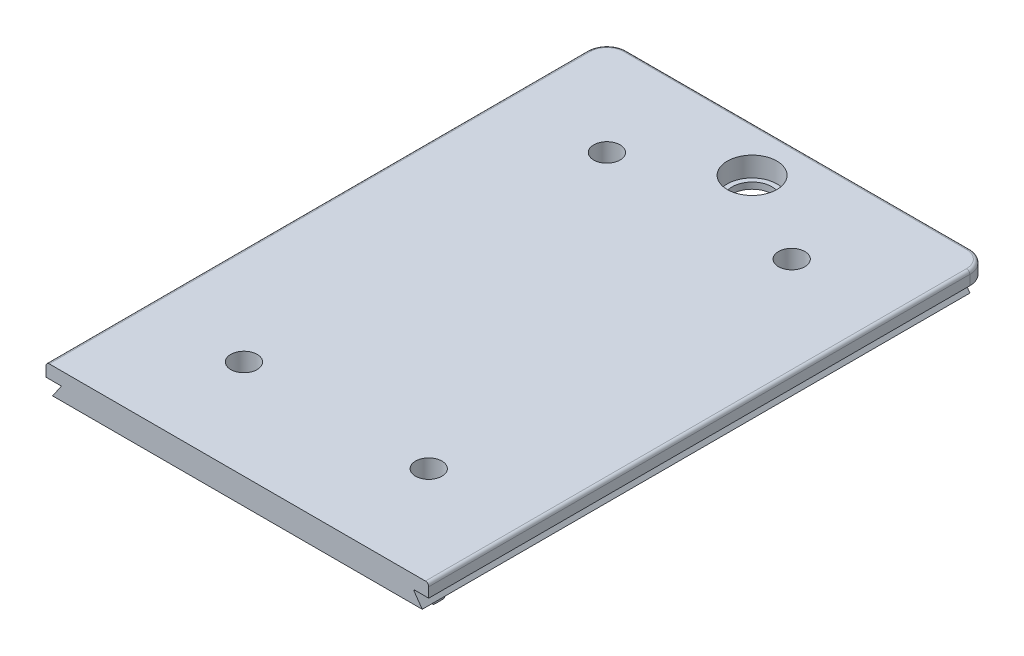
ISO-10303-21;
HEADER;
FILE_DESCRIPTION(('STEP AP214'),'2;1');
FILE_NAME('part.step','',(''),(''),'','','');
FILE_SCHEMA(('AUTOMOTIVE_DESIGN { 1 0 10303 214 1 1 1 1 }'));
ENDSEC;
DATA;
#1=APPLICATION_CONTEXT('core data for automotive mechanical design processes');
#2=APPLICATION_PROTOCOL_DEFINITION('international standard','automotive_design',2000,#1);
#3=PRODUCT_CONTEXT('',#1,'mechanical');
#4=PRODUCT('Part','Part','',(#3));
#5=PRODUCT_RELATED_PRODUCT_CATEGORY('part','',(#4));
#6=PRODUCT_DEFINITION_FORMATION('','',#4);
#7=PRODUCT_DEFINITION_CONTEXT('part definition',#1,'design');
#8=PRODUCT_DEFINITION('design','',#6,#7);
#9=PRODUCT_DEFINITION_SHAPE('','',#8);
#10=(LENGTH_UNIT() NAMED_UNIT(*) SI_UNIT(.MILLI.,.METRE.));
#11=(NAMED_UNIT(*) PLANE_ANGLE_UNIT() SI_UNIT($,.RADIAN.));
#12=(NAMED_UNIT(*) SI_UNIT($,.STERADIAN.) SOLID_ANGLE_UNIT());
#13=UNCERTAINTY_MEASURE_WITH_UNIT(LENGTH_MEASURE(1.E-05),#10,'distance_accuracy_value','');
#14=(GEOMETRIC_REPRESENTATION_CONTEXT(3) GLOBAL_UNCERTAINTY_ASSIGNED_CONTEXT((#13)) GLOBAL_UNIT_ASSIGNED_CONTEXT((#10,
#11,#12)) REPRESENTATION_CONTEXT('',''));
#15=CARTESIAN_POINT('',(0.,0.,0.));
#16=DIRECTION('',(0.,0.,1.));
#17=DIRECTION('',(1.,0.,0.));
#18=AXIS2_PLACEMENT_3D('',#15,#16,#17);
#19=CARTESIAN_POINT('',(0.,26.949,-78.));
#20=DIRECTION('',(0.,1.,0.));
#21=DIRECTION('',(0.,0.,1.));
#22=AXIS2_PLACEMENT_3D('',#19,#20,#21);
#23=CYLINDRICAL_SURFACE('',#22,3.);
#24=CARTESIAN_POINT('',(0.,27.2,-78.));
#25=DIRECTION('',(0.,-1.,0.));
#26=DIRECTION('',(1.,0.,0.));
#27=AXIS2_PLACEMENT_3D('',#24,#25,#26);
#28=CIRCLE('',#27,3.);
#29=CARTESIAN_POINT('',(3.,27.2,-78.));
#30=VERTEX_POINT('',#29);
#31=EDGE_CURVE('E227',#30,#30,#28,.F.);
#32=ORIENTED_EDGE('',*,*,#31,.F.);
#33=EDGE_LOOP('',(#32));
#34=FACE_BOUND('',#33,.T.);
#35=CARTESIAN_POINT('',(0.,28.15,-78.));
#36=DIRECTION('',(0.,1.,0.));
#37=DIRECTION('',(0.,0.,1.));
#38=AXIS2_PLACEMENT_3D('',#35,#36,#37);
#39=CIRCLE('',#38,3.);
#40=CARTESIAN_POINT('',(0.,28.15,-75.));
#41=VERTEX_POINT('',#40);
#42=EDGE_CURVE('E51',#41,#41,#39,.F.);
#43=ORIENTED_EDGE('',*,*,#42,.F.);
#44=EDGE_LOOP('',(#43));
#45=FACE_BOUND('',#44,.T.);
#46=ADVANCED_FACE('F47',(#34,#45),#23,.F.);
#47=CARTESIAN_POINT('',(-28.0162186510252,27.2,-141.134348710552));
#48=DIRECTION('',(0.,-1.,0.));
#49=DIRECTION('',(1.,0.,0.));
#50=AXIS2_PLACEMENT_3D('',#47,#48,#49);
#51=PLANE('',#50);
#52=CARTESIAN_POINT('',(-14.,27.2,-15.));
#53=DIRECTION('',(0.,-1.,0.));
#54=DIRECTION('',(1.,0.,0.));
#55=AXIS2_PLACEMENT_3D('',#52,#53,#54);
#56=CIRCLE('',#55,2.);
#57=CARTESIAN_POINT('',(-12.,27.2,-15.));
#58=VERTEX_POINT('',#57);
#59=EDGE_CURVE('E401',#58,#58,#56,.F.);
#60=ORIENTED_EDGE('',*,*,#59,.T.);
#61=EDGE_LOOP('',(#60));
#62=FACE_BOUND('',#61,.T.);
#63=CARTESIAN_POINT('',(-14.,27.2,-70.));
#64=DIRECTION('',(0.,-1.,0.));
#65=DIRECTION('',(1.,0.,0.));
#66=AXIS2_PLACEMENT_3D('',#63,#64,#65);
#67=CIRCLE('',#66,2.);
#68=CARTESIAN_POINT('',(-12.,27.2,-70.));
#69=VERTEX_POINT('',#68);
#70=EDGE_CURVE('E924',#69,#69,#67,.F.);
#71=ORIENTED_EDGE('',*,*,#70,.T.);
#72=EDGE_LOOP('',(#71));
#73=FACE_BOUND('',#72,.T.);
#74=CARTESIAN_POINT('',(14.,27.2,-70.));
#75=DIRECTION('',(0.,-1.,0.));
#76=DIRECTION('',(1.,0.,0.));
#77=AXIS2_PLACEMENT_3D('',#74,#75,#76);
#78=CIRCLE('',#77,2.00000000000001);
#79=CARTESIAN_POINT('',(16.,27.2,-70.));
#80=VERTEX_POINT('',#79);
#81=EDGE_CURVE('E419',#80,#80,#78,.F.);
#82=ORIENTED_EDGE('',*,*,#81,.T.);
#83=EDGE_LOOP('',(#82));
#84=FACE_BOUND('',#83,.T.);
#85=CARTESIAN_POINT('',(14.,27.2,-15.));
#86=DIRECTION('',(0.,-1.,0.));
#87=DIRECTION('',(1.,0.,0.));
#88=AXIS2_PLACEMENT_3D('',#85,#86,#87);
#89=CIRCLE('',#88,2.);
#90=CARTESIAN_POINT('',(16.,27.2,-15.));
#91=VERTEX_POINT('',#90);
#92=EDGE_CURVE('E415',#91,#91,#89,.F.);
#93=ORIENTED_EDGE('',*,*,#92,.T.);
#94=EDGE_LOOP('',(#93));
#95=FACE_BOUND('',#94,.T.);
#96=ORIENTED_EDGE('',*,*,#31,.T.);
#97=EDGE_LOOP('',(#96));
#98=FACE_BOUND('',#97,.T.);
#99=DIRECTION('',(1.,0.,0.));
#100=VECTOR('',#99,1.);
#101=CARTESIAN_POINT('',(28.0162186510252,27.2,-3.5));
#102=LINE('',#101,#100);
#103=CARTESIAN_POINT('',(-28.0162186510252,27.2,-3.50000000000006));
#104=VERTEX_POINT('',#103);
#105=CARTESIAN_POINT('',(28.0162186510252,27.2,-3.50000000000006));
#106=VERTEX_POINT('',#105);
#107=EDGE_CURVE('E207',#104,#106,#102,.T.);
#108=ORIENTED_EDGE('',*,*,#107,.F.);
#109=DIRECTION('',(0.,0.,1.));
#110=VECTOR('',#109,1.);
#111=CARTESIAN_POINT('',(-28.0162186510252,27.2,-141.134348710552));
#112=LINE('',#111,#110);
#113=CARTESIAN_POINT('',(-28.0162186510252,27.2,-83.));
#114=VERTEX_POINT('',#113);
#115=EDGE_CURVE('E205',#114,#104,#112,.T.);
#116=ORIENTED_EDGE('',*,*,#115,.F.);
#117=DIRECTION('',(-1.,0.,0.));
#118=VECTOR('',#117,1.);
#119=CARTESIAN_POINT('',(-28.0162186510252,27.2,-83.));
#120=LINE('',#119,#118);
#121=CARTESIAN_POINT('',(28.0162186510252,27.2,-83.));
#122=VERTEX_POINT('',#121);
#123=EDGE_CURVE('E246',#122,#114,#120,.T.);
#124=ORIENTED_EDGE('',*,*,#123,.F.);
#125=DIRECTION('',(0.,0.,1.));
#126=VECTOR('',#125,1.);
#127=CARTESIAN_POINT('',(28.0162186510252,27.2,-141.134348710552));
#128=LINE('',#127,#126);
#129=EDGE_CURVE('E309',#122,#106,#128,.T.);
#130=ORIENTED_EDGE('',*,*,#129,.T.);
#131=EDGE_LOOP('',(#108,#116,#124,#130));
#132=FACE_BOUND('',#131,.T.);
#133=ADVANCED_FACE('F442',(#62,#73,#84,#95,#98,#132),#51,.T.);
#134=CARTESIAN_POINT('',(-27.,27.,-83.));
#135=DIRECTION('',(0.,0.,1.));
#136=DIRECTION('',(-1.,0.,0.));
#137=AXIS2_PLACEMENT_3D('',#134,#135,#136);
#138=PLANE('',#137);
#139=DIRECTION('',(-1.,0.,0.));
#140=VECTOR('',#139,1.);
#141=CARTESIAN_POINT('',(29.,29.15,-83.));
#142=LINE('',#141,#140);
#143=CARTESIAN_POINT('',(26.7558450822477,29.15,-83.));
#144=VERTEX_POINT('',#143);
#145=CARTESIAN_POINT('',(-26.7558450822477,29.15,-83.));
#146=VERTEX_POINT('',#145);
#147=EDGE_CURVE('E240',#144,#146,#142,.T.);
#148=ORIENTED_EDGE('',*,*,#147,.F.);
#149=DIRECTION('',(0.,-1.,0.));
#150=VECTOR('',#149,1.);
#151=CARTESIAN_POINT('',(26.7558450822477,29.,-83.));
#152=LINE('',#151,#150);
#153=CARTESIAN_POINT('',(26.7558450822477,29.,-83.));
#154=VERTEX_POINT('',#153);
#155=EDGE_CURVE('E253',#144,#154,#152,.T.);
#156=ORIENTED_EDGE('',*,*,#155,.T.);
#157=DIRECTION('',(0.573576436351053,-0.819152044288987,0.));
#158=VECTOR('',#157,1.);
#159=CARTESIAN_POINT('',(28.0162186510252,27.2,-83.));
#160=LINE('',#159,#158);
#161=EDGE_CURVE('E249',#154,#122,#160,.T.);
#162=ORIENTED_EDGE('',*,*,#161,.T.);
#163=ORIENTED_EDGE('',*,*,#123,.T.);
#164=DIRECTION('',(0.573576436351054,0.819152044288987,0.));
#165=VECTOR('',#164,1.);
#166=CARTESIAN_POINT('',(-26.7558450822477,29.,-83.));
#167=LINE('',#166,#165);
#168=CARTESIAN_POINT('',(-26.7558450822477,29.,-83.));
#169=VERTEX_POINT('',#168);
#170=EDGE_CURVE('E245',#114,#169,#167,.T.);
#171=ORIENTED_EDGE('',*,*,#170,.T.);
#172=DIRECTION('',(0.,1.,0.));
#173=VECTOR('',#172,1.);
#174=CARTESIAN_POINT('',(-26.7558450822477,29.,-83.));
#175=LINE('',#174,#173);
#176=EDGE_CURVE('E256',#169,#146,#175,.T.);
#177=ORIENTED_EDGE('',*,*,#176,.T.);
#178=EDGE_LOOP('',(#148,#156,#162,#163,#171,#177));
#179=FACE_BOUND('',#178,.T.);
#180=ADVANCED_FACE('F444',(#179),#138,.F.);
#181=CARTESIAN_POINT('',(-26.7558450822477,29.,-141.134348710552));
#182=DIRECTION('',(-1.,0.,0.));
#183=DIRECTION('',(0.,0.,1.));
#184=AXIS2_PLACEMENT_3D('',#181,#182,#183);
#185=PLANE('',#184);
#186=ORIENTED_EDGE('',*,*,#176,.F.);
#187=DIRECTION('',(0.,0.,1.));
#188=VECTOR('',#187,1.);
#189=CARTESIAN_POINT('',(-26.7558450822477,29.,-141.134348710552));
#190=LINE('',#189,#188);
#191=CARTESIAN_POINT('',(-26.7558450822477,29.,0.));
#192=VERTEX_POINT('',#191);
#193=EDGE_CURVE('E217',#169,#192,#190,.T.);
#194=ORIENTED_EDGE('',*,*,#193,.T.);
#195=DIRECTION('',(0.,-1.,0.));
#196=VECTOR('',#195,1.);
#197=CARTESIAN_POINT('',(-26.7558450822477,29.,0.));
#198=LINE('',#197,#196);
#199=CARTESIAN_POINT('',(-26.7558450822477,29.15,0.));
#200=VERTEX_POINT('',#199);
#201=EDGE_CURVE('E239',#200,#192,#198,.T.);
#202=ORIENTED_EDGE('',*,*,#201,.F.);
#203=DIRECTION('',(0.,0.,1.));
#204=VECTOR('',#203,1.);
#205=CARTESIAN_POINT('',(-26.7558450822477,29.15,-141.134348710552));
#206=LINE('',#205,#204);
#207=EDGE_CURVE('E250',#146,#200,#206,.T.);
#208=ORIENTED_EDGE('',*,*,#207,.F.);
#209=EDGE_LOOP('',(#186,#194,#202,#208));
#210=FACE_BOUND('',#209,.T.);
#211=ADVANCED_FACE('F458',(#210),#185,.T.);
#212=CARTESIAN_POINT('',(-26.7558450822477,29.15,-141.134348710552));
#213=DIRECTION('',(0.,-1.,0.));
#214=DIRECTION('',(0.,0.,-1.));
#215=AXIS2_PLACEMENT_3D('',#212,#213,#214);
#216=PLANE('',#215);
#217=DIRECTION('',(1.,0.,0.));
#218=VECTOR('',#217,1.);
#219=CARTESIAN_POINT('',(29.,29.15,-85.));
#220=LINE('',#219,#218);
#221=CARTESIAN_POINT('',(-26.,29.15,-85.));
#222=VERTEX_POINT('',#221);
#223=CARTESIAN_POINT('',(26.,29.15,-85.));
#224=VERTEX_POINT('',#223);
#225=EDGE_CURVE('E235',#222,#224,#220,.T.);
#226=ORIENTED_EDGE('',*,*,#225,.T.);
#227=CARTESIAN_POINT('',(26.,29.15,-82.));
#228=DIRECTION('',(0.,-1.,0.));
#229=DIRECTION('',(0.,0.,-1.));
#230=AXIS2_PLACEMENT_3D('',#227,#228,#229);
#231=CIRCLE('',#230,3.);
#232=CARTESIAN_POINT('',(29.,29.15,-82.));
#233=VERTEX_POINT('',#232);
#234=EDGE_CURVE('E330',#224,#233,#231,.T.);
#235=ORIENTED_EDGE('',*,*,#234,.T.);
#236=DIRECTION('',(0.,0.,1.));
#237=VECTOR('',#236,1.);
#238=CARTESIAN_POINT('',(29.,29.15,-141.134348710552));
#239=LINE('',#238,#237);
#240=CARTESIAN_POINT('',(29.,29.15,0.));
#241=VERTEX_POINT('',#240);
#242=EDGE_CURVE('E300',#233,#241,#239,.T.);
#243=ORIENTED_EDGE('',*,*,#242,.T.);
#244=DIRECTION('',(1.,0.,0.));
#245=VECTOR('',#244,1.);
#246=CARTESIAN_POINT('',(26.7558450822477,29.15,0.));
#247=LINE('',#246,#245);
#248=CARTESIAN_POINT('',(26.7558450822477,29.15,0.));
#249=VERTEX_POINT('',#248);
#250=EDGE_CURVE('E275',#249,#241,#247,.T.);
#251=ORIENTED_EDGE('',*,*,#250,.F.);
#252=DIRECTION('',(0.,0.,1.));
#253=VECTOR('',#252,1.);
#254=CARTESIAN_POINT('',(26.7558450822477,29.15,-141.134348710552));
#255=LINE('',#254,#253);
#256=EDGE_CURVE('E303',#144,#249,#255,.T.);
#257=ORIENTED_EDGE('',*,*,#256,.F.);
#258=ORIENTED_EDGE('',*,*,#147,.T.);
#259=ORIENTED_EDGE('',*,*,#207,.T.);
#260=DIRECTION('',(1.,0.,0.));
#261=VECTOR('',#260,1.);
#262=CARTESIAN_POINT('',(-26.7558450822477,29.15,0.));
#263=LINE('',#262,#261);
#264=CARTESIAN_POINT('',(-29.,29.15,0.));
#265=VERTEX_POINT('',#264);
#266=EDGE_CURVE('E290',#265,#200,#263,.T.);
#267=ORIENTED_EDGE('',*,*,#266,.F.);
#268=DIRECTION('',(0.,0.,1.));
#269=VECTOR('',#268,1.);
#270=CARTESIAN_POINT('',(-29.,29.15,-141.134348710552));
#271=LINE('',#270,#269);
#272=CARTESIAN_POINT('',(-29.,29.15,-82.));
#273=VERTEX_POINT('',#272);
#274=EDGE_CURVE('E296',#273,#265,#271,.T.);
#275=ORIENTED_EDGE('',*,*,#274,.F.);
#276=CARTESIAN_POINT('',(-26.,29.15,-82.));
#277=DIRECTION('',(0.,-1.,0.));
#278=DIRECTION('',(0.,0.,-1.));
#279=AXIS2_PLACEMENT_3D('',#276,#277,#278);
#280=CIRCLE('',#279,3.);
#281=EDGE_CURVE('E327',#273,#222,#280,.T.);
#282=ORIENTED_EDGE('',*,*,#281,.T.);
#283=EDGE_LOOP('',(#226,#235,#243,#251,#257,#258,#259,#267,#275,#282));
#284=FACE_BOUND('',#283,.T.);
#285=ADVANCED_FACE('F461',(#284),#216,.T.);
#286=CARTESIAN_POINT('',(-29.,29.15,-141.134348710552));
#287=DIRECTION('',(-1.,0.,0.));
#288=DIRECTION('',(0.,0.,1.));
#289=AXIS2_PLACEMENT_3D('',#286,#287,#288);
#290=PLANE('',#289);
#291=DIRECTION('',(0.,-1.,0.));
#292=VECTOR('',#291,1.);
#293=CARTESIAN_POINT('',(-29.,29.15,0.));
#294=LINE('',#293,#292);
#295=CARTESIAN_POINT('',(-29.,30.65,0.));
#296=VERTEX_POINT('',#295);
#297=EDGE_CURVE('E287',#296,#265,#294,.T.);
#298=ORIENTED_EDGE('',*,*,#297,.F.);
#299=DIRECTION('',(0.,0.,1.));
#300=VECTOR('',#299,1.);
#301=CARTESIAN_POINT('',(-29.,30.65,-141.134348710552));
#302=LINE('',#301,#300);
#303=CARTESIAN_POINT('',(-29.,30.65,-82.));
#304=VERTEX_POINT('',#303);
#305=EDGE_CURVE('E371',#296,#304,#302,.F.);
#306=ORIENTED_EDGE('',*,*,#305,.T.);
#307=DIRECTION('',(0.,-1.,0.));
#308=VECTOR('',#307,1.);
#309=CARTESIAN_POINT('',(-29.,29.15,-82.));
#310=LINE('',#309,#308);
#311=EDGE_CURVE('E333',#304,#273,#310,.T.);
#312=ORIENTED_EDGE('',*,*,#311,.T.);
#313=ORIENTED_EDGE('',*,*,#274,.T.);
#314=EDGE_LOOP('',(#298,#306,#312,#313));
#315=FACE_BOUND('',#314,.T.);
#316=ADVANCED_FACE('F479',(#315),#290,.T.);
#317=CARTESIAN_POINT('',(-29.,31.15,-141.134348710552));
#318=DIRECTION('',(0.,1.,0.));
#319=DIRECTION('',(0.,0.,1.));
#320=AXIS2_PLACEMENT_3D('',#317,#318,#319);
#321=PLANE('',#320);
#322=CARTESIAN_POINT('',(0.,31.15,-78.));
#323=DIRECTION('',(0.,1.,0.));
#324=DIRECTION('',(0.,0.,1.));
#325=AXIS2_PLACEMENT_3D('',#322,#323,#324);
#326=CIRCLE('',#325,3.75);
#327=CARTESIAN_POINT('',(0.,31.15,-74.25));
#328=VERTEX_POINT('',#327);
#329=EDGE_CURVE('E937',#328,#328,#326,.T.);
#330=ORIENTED_EDGE('',*,*,#329,.F.);
#331=EDGE_LOOP('',(#330));
#332=FACE_BOUND('',#331,.T.);
#333=CARTESIAN_POINT('',(-14.,31.15,-15.));
#334=DIRECTION('',(0.,1.,0.));
#335=DIRECTION('',(0.,0.,-1.));
#336=AXIS2_PLACEMENT_3D('',#333,#334,#335);
#337=CIRCLE('',#336,2.);
#338=CARTESIAN_POINT('',(-14.,31.15,-17.));
#339=VERTEX_POINT('',#338);
#340=EDGE_CURVE('E395',#339,#339,#337,.T.);
#341=ORIENTED_EDGE('',*,*,#340,.F.);
#342=EDGE_LOOP('',(#341));
#343=FACE_BOUND('',#342,.T.);
#344=CARTESIAN_POINT('',(-14.,31.15,-70.));
#345=DIRECTION('',(0.,1.,0.));
#346=DIRECTION('',(0.,0.,1.));
#347=AXIS2_PLACEMENT_3D('',#344,#345,#346);
#348=CIRCLE('',#347,2.);
#349=CARTESIAN_POINT('',(-14.,31.15,-68.));
#350=VERTEX_POINT('',#349);
#351=EDGE_CURVE('E407',#350,#350,#348,.T.);
#352=ORIENTED_EDGE('',*,*,#351,.F.);
#353=EDGE_LOOP('',(#352));
#354=FACE_BOUND('',#353,.T.);
#355=CARTESIAN_POINT('',(14.,31.15,-70.));
#356=DIRECTION('',(0.,1.,0.));
#357=DIRECTION('',(0.,0.,-1.));
#358=AXIS2_PLACEMENT_3D('',#355,#356,#357);
#359=CIRCLE('',#358,2.00000000000001);
#360=CARTESIAN_POINT('',(14.,31.15,-72.));
#361=VERTEX_POINT('',#360);
#362=EDGE_CURVE('E921',#361,#361,#359,.T.);
#363=ORIENTED_EDGE('',*,*,#362,.F.);
#364=EDGE_LOOP('',(#363));
#365=FACE_BOUND('',#364,.T.);
#366=CARTESIAN_POINT('',(14.,31.15,-15.));
#367=DIRECTION('',(0.,1.,0.));
#368=DIRECTION('',(0.,0.,1.));
#369=AXIS2_PLACEMENT_3D('',#366,#367,#368);
#370=CIRCLE('',#369,2.);
#371=CARTESIAN_POINT('',(14.,31.15,-13.));
#372=VERTEX_POINT('',#371);
#373=EDGE_CURVE('E411',#372,#372,#370,.T.);
#374=ORIENTED_EDGE('',*,*,#373,.F.);
#375=EDGE_LOOP('',(#374));
#376=FACE_BOUND('',#375,.T.);
#377=CARTESIAN_POINT('',(-26.,31.15,-82.));
#378=DIRECTION('',(0.,1.,0.));
#379=DIRECTION('',(0.,0.,1.));
#380=AXIS2_PLACEMENT_3D('',#377,#378,#379);
#381=CIRCLE('',#380,2.5);
#382=CARTESIAN_POINT('',(-26.,31.15,-84.5));
#383=VERTEX_POINT('',#382);
#384=CARTESIAN_POINT('',(-28.5,31.15,-82.));
#385=VERTEX_POINT('',#384);
#386=EDGE_CURVE('E358',#383,#385,#381,.T.);
#387=ORIENTED_EDGE('',*,*,#386,.T.);
#388=DIRECTION('',(0.,0.,1.));
#389=VECTOR('',#388,1.);
#390=CARTESIAN_POINT('',(-28.5,31.15,-141.134348710552));
#391=LINE('',#390,#389);
#392=CARTESIAN_POINT('',(-28.5,31.15,0.));
#393=VERTEX_POINT('',#392);
#394=EDGE_CURVE('E361',#385,#393,#391,.T.);
#395=ORIENTED_EDGE('',*,*,#394,.T.);
#396=DIRECTION('',(-1.,0.,0.));
#397=VECTOR('',#396,1.);
#398=CARTESIAN_POINT('',(-29.,31.15,0.));
#399=LINE('',#398,#397);
#400=CARTESIAN_POINT('',(28.5,31.15,0.));
#401=VERTEX_POINT('',#400);
#402=EDGE_CURVE('E283',#401,#393,#399,.T.);
#403=ORIENTED_EDGE('',*,*,#402,.F.);
#404=DIRECTION('',(0.,0.,1.));
#405=VECTOR('',#404,1.);
#406=CARTESIAN_POINT('',(28.5,31.15,-141.134348710552));
#407=LINE('',#406,#405);
#408=CARTESIAN_POINT('',(28.5,31.15,-82.));
#409=VERTEX_POINT('',#408);
#410=EDGE_CURVE('E349',#401,#409,#407,.F.);
#411=ORIENTED_EDGE('',*,*,#410,.T.);
#412=CARTESIAN_POINT('',(26.,31.15,-82.));
#413=DIRECTION('',(0.,1.,0.));
#414=DIRECTION('',(0.,0.,1.));
#415=AXIS2_PLACEMENT_3D('',#412,#413,#414);
#416=CIRCLE('',#415,2.5);
#417=CARTESIAN_POINT('',(26.,31.15,-84.5));
#418=VERTEX_POINT('',#417);
#419=EDGE_CURVE('E352',#409,#418,#416,.T.);
#420=ORIENTED_EDGE('',*,*,#419,.T.);
#421=DIRECTION('',(-1.,0.,0.));
#422=VECTOR('',#421,1.);
#423=CARTESIAN_POINT('',(-26.,31.15,-84.5));
#424=LINE('',#423,#422);
#425=EDGE_CURVE('E355',#418,#383,#424,.T.);
#426=ORIENTED_EDGE('',*,*,#425,.T.);
#427=EDGE_LOOP('',(#387,#395,#403,#411,#420,#426));
#428=FACE_BOUND('',#427,.T.);
#429=ADVANCED_FACE('F472',(#332,#343,#354,#365,#376,#428),#321,.T.);
#430=CARTESIAN_POINT('',(29.,29.15,-141.134348710552));
#431=DIRECTION('',(1.,0.,0.));
#432=DIRECTION('',(0.,0.,-1.));
#433=AXIS2_PLACEMENT_3D('',#430,#431,#432);
#434=PLANE('',#433);
#435=DIRECTION('',(0.,1.,0.));
#436=VECTOR('',#435,1.);
#437=CARTESIAN_POINT('',(29.,31.15,-82.));
#438=LINE('',#437,#436);
#439=CARTESIAN_POINT('',(29.,30.65,-82.));
#440=VERTEX_POINT('',#439);
#441=EDGE_CURVE('E244',#233,#440,#438,.T.);
#442=ORIENTED_EDGE('',*,*,#441,.T.);
#443=DIRECTION('',(0.,0.,1.));
#444=VECTOR('',#443,1.);
#445=CARTESIAN_POINT('',(29.,30.65,-141.134348710552));
#446=LINE('',#445,#444);
#447=CARTESIAN_POINT('',(29.,30.65,0.));
#448=VERTEX_POINT('',#447);
#449=EDGE_CURVE('E11',#440,#448,#446,.T.);
#450=ORIENTED_EDGE('',*,*,#449,.T.);
#451=DIRECTION('',(0.,1.,0.));
#452=VECTOR('',#451,1.);
#453=CARTESIAN_POINT('',(29.,29.15,0.));
#454=LINE('',#453,#452);
#455=EDGE_CURVE('E279',#241,#448,#454,.T.);
#456=ORIENTED_EDGE('',*,*,#455,.F.);
#457=ORIENTED_EDGE('',*,*,#242,.F.);
#458=EDGE_LOOP('',(#442,#450,#456,#457));
#459=FACE_BOUND('',#458,.T.);
#460=ADVANCED_FACE('F539',(#459),#434,.T.);
#461=CARTESIAN_POINT('',(26.7558450822477,29.,-141.134348710552));
#462=DIRECTION('',(1.,0.,0.));
#463=DIRECTION('',(0.,1.,0.));
#464=AXIS2_PLACEMENT_3D('',#461,#462,#463);
#465=PLANE('',#464);
#466=ORIENTED_EDGE('',*,*,#155,.F.);
#467=ORIENTED_EDGE('',*,*,#256,.T.);
#468=DIRECTION('',(0.,1.,0.));
#469=VECTOR('',#468,1.);
#470=CARTESIAN_POINT('',(26.7558450822477,29.,0.));
#471=LINE('',#470,#469);
#472=CARTESIAN_POINT('',(26.7558450822477,29.,0.));
#473=VERTEX_POINT('',#472);
#474=EDGE_CURVE('E271',#473,#249,#471,.T.);
#475=ORIENTED_EDGE('',*,*,#474,.F.);
#476=DIRECTION('',(0.,0.,1.));
#477=VECTOR('',#476,1.);
#478=CARTESIAN_POINT('',(26.7558450822477,29.,-141.134348710552));
#479=LINE('',#478,#477);
#480=EDGE_CURVE('E306',#154,#473,#479,.T.);
#481=ORIENTED_EDGE('',*,*,#480,.F.);
#482=EDGE_LOOP('',(#466,#467,#475,#481));
#483=FACE_BOUND('',#482,.T.);
#484=ADVANCED_FACE('F450',(#483),#465,.T.);
#485=CARTESIAN_POINT('',(28.0162186510252,27.2,-141.134348710552));
#486=DIRECTION('',(0.819152044288987,0.573576436351053,0.));
#487=DIRECTION('',(-0.573576436351053,0.819152044288987,0.));
#488=AXIS2_PLACEMENT_3D('',#485,#486,#487);
#489=PLANE('',#488);
#490=ORIENTED_EDGE('',*,*,#161,.F.);
#491=ORIENTED_EDGE('',*,*,#480,.T.);
#492=DIRECTION('',(-0.573576436351053,0.819152044288987,0.));
#493=VECTOR('',#492,1.);
#494=CARTESIAN_POINT('',(28.0162186510252,27.2,0.));
#495=LINE('',#494,#493);
#496=CARTESIAN_POINT('',(28.0162186510252,27.2,0.));
#497=VERTEX_POINT('',#496);
#498=EDGE_CURVE('E267',#497,#473,#495,.T.);
#499=ORIENTED_EDGE('',*,*,#498,.F.);
#500=CARTESIAN_POINT('',(28.0162186510252,27.2,-1.50000000000006));
#501=VERTEX_POINT('',#500);
#502=EDGE_CURVE('E312',#501,#497,#128,.T.);
#503=ORIENTED_EDGE('',*,*,#502,.F.);
#504=DIRECTION('',(0.,0.,1.));
#505=VECTOR('',#504,1.);
#506=CARTESIAN_POINT('',(28.0162186510252,27.2,-1.5));
#507=LINE('',#506,#505);
#508=EDGE_CURVE('E223',#106,#501,#507,.T.);
#509=ORIENTED_EDGE('',*,*,#508,.F.);
#510=ORIENTED_EDGE('',*,*,#129,.F.);
#511=EDGE_LOOP('',(#490,#491,#499,#503,#509,#510));
#512=FACE_BOUND('',#511,.T.);
#513=ADVANCED_FACE('F438',(#512),#489,.T.);
#514=DIRECTION('',(-1.,0.,0.));
#515=VECTOR('',#514,1.);
#516=CARTESIAN_POINT('',(28.0162186510252,27.2,-1.5));
#517=LINE('',#516,#515);
#518=CARTESIAN_POINT('',(-28.0162186510252,27.2,-1.50000000000001));
#519=VERTEX_POINT('',#518);
#520=EDGE_CURVE('E208',#501,#519,#517,.T.);
#521=ORIENTED_EDGE('',*,*,#520,.F.);
#522=ORIENTED_EDGE('',*,*,#502,.T.);
#523=DIRECTION('',(1.,0.,0.));
#524=VECTOR('',#523,1.);
#525=CARTESIAN_POINT('',(-28.0162186510252,27.2,0.));
#526=LINE('',#525,#524);
#527=CARTESIAN_POINT('',(-28.0162186510252,27.2,0.));
#528=VERTEX_POINT('',#527);
#529=EDGE_CURVE('E214',#528,#497,#526,.T.);
#530=ORIENTED_EDGE('',*,*,#529,.F.);
#531=EDGE_CURVE('E202',#519,#528,#112,.T.);
#532=ORIENTED_EDGE('',*,*,#531,.F.);
#533=EDGE_LOOP('',(#521,#522,#530,#532));
#534=FACE_BOUND('',#533,.T.);
#535=ADVANCED_FACE('F211',(#534),#51,.T.);
#536=CARTESIAN_POINT('',(-26.7558450822477,29.,-141.134348710552));
#537=DIRECTION('',(-0.819152044288987,0.573576436351054,0.));
#538=DIRECTION('',(-0.573576436351054,-0.819152044288987,0.));
#539=AXIS2_PLACEMENT_3D('',#536,#537,#538);
#540=PLANE('',#539);
#541=ORIENTED_EDGE('',*,*,#170,.F.);
#542=ORIENTED_EDGE('',*,*,#115,.T.);
#543=DIRECTION('',(0.,0.,-1.));
#544=VECTOR('',#543,1.);
#545=CARTESIAN_POINT('',(-28.0162186510252,27.2,-1.50000000000001));
#546=LINE('',#545,#544);
#547=EDGE_CURVE('E184',#519,#104,#546,.T.);
#548=ORIENTED_EDGE('',*,*,#547,.F.);
#549=ORIENTED_EDGE('',*,*,#531,.T.);
#550=DIRECTION('',(-0.573576436351054,-0.819152044288986,0.));
#551=VECTOR('',#550,1.);
#552=CARTESIAN_POINT('',(-26.7558450822477,29.,0.));
#553=LINE('',#552,#551);
#554=EDGE_CURVE('E262',#192,#528,#553,.T.);
#555=ORIENTED_EDGE('',*,*,#554,.F.);
#556=ORIENTED_EDGE('',*,*,#193,.F.);
#557=EDGE_LOOP('',(#541,#542,#548,#549,#555,#556));
#558=FACE_BOUND('',#557,.T.);
#559=ADVANCED_FACE('F200',(#558),#540,.T.);
#560=CARTESIAN_POINT('',(0.,0.,0.));
#561=DIRECTION('',(0.,0.,1.));
#562=DIRECTION('',(1.,0.,0.));
#563=AXIS2_PLACEMENT_3D('',#560,#561,#562);
#564=PLANE('',#563);
#565=ORIENTED_EDGE('',*,*,#402,.T.);
#566=CARTESIAN_POINT('',(-28.5,30.65,0.));
#567=DIRECTION('',(0.,0.,1.));
#568=DIRECTION('',(1.,0.,0.));
#569=AXIS2_PLACEMENT_3D('',#566,#567,#568);
#570=CIRCLE('',#569,0.5);
#571=EDGE_CURVE('E368',#393,#296,#570,.T.);
#572=ORIENTED_EDGE('',*,*,#571,.T.);
#573=ORIENTED_EDGE('',*,*,#297,.T.);
#574=ORIENTED_EDGE('',*,*,#266,.T.);
#575=ORIENTED_EDGE('',*,*,#201,.T.);
#576=ORIENTED_EDGE('',*,*,#554,.T.);
#577=ORIENTED_EDGE('',*,*,#529,.T.);
#578=ORIENTED_EDGE('',*,*,#498,.T.);
#579=ORIENTED_EDGE('',*,*,#474,.T.);
#580=ORIENTED_EDGE('',*,*,#250,.T.);
#581=ORIENTED_EDGE('',*,*,#455,.T.);
#582=CARTESIAN_POINT('',(28.5,30.65,0.));
#583=DIRECTION('',(0.,0.,1.));
#584=DIRECTION('',(1.,0.,0.));
#585=AXIS2_PLACEMENT_3D('',#582,#583,#584);
#586=CIRCLE('',#585,0.5);
#587=EDGE_CURVE('E365',#448,#401,#586,.T.);
#588=ORIENTED_EDGE('',*,*,#587,.T.);
#589=EDGE_LOOP('',(#565,#572,#573,#574,#575,#576,#577,#578,#579,#580,#581,#588));
#590=FACE_BOUND('',#589,.T.);
#591=ADVANCED_FACE('F454',(#590),#564,.T.);
#592=CARTESIAN_POINT('',(29.,2.,-85.));
#593=DIRECTION('',(0.,0.,1.));
#594=DIRECTION('',(-1.,0.,0.));
#595=AXIS2_PLACEMENT_3D('',#592,#593,#594);
#596=PLANE('',#595);
#597=DIRECTION('',(0.,-1.,0.));
#598=VECTOR('',#597,1.);
#599=CARTESIAN_POINT('',(-26.,31.15,-85.));
#600=LINE('',#599,#598);
#601=CARTESIAN_POINT('',(-26.,30.65,-85.));
#602=VERTEX_POINT('',#601);
#603=EDGE_CURVE('E321',#222,#602,#600,.F.);
#604=ORIENTED_EDGE('',*,*,#603,.T.);
#605=DIRECTION('',(-1.,0.,0.));
#606=VECTOR('',#605,1.);
#607=CARTESIAN_POINT('',(26.,30.65,-85.));
#608=LINE('',#607,#606);
#609=CARTESIAN_POINT('',(26.,30.65,-85.));
#610=VERTEX_POINT('',#609);
#611=EDGE_CURVE('E72',#602,#610,#608,.F.);
#612=ORIENTED_EDGE('',*,*,#611,.T.);
#613=DIRECTION('',(0.,1.,0.));
#614=VECTOR('',#613,1.);
#615=CARTESIAN_POINT('',(26.,29.15,-85.));
#616=LINE('',#615,#614);
#617=EDGE_CURVE('E324',#610,#224,#616,.F.);
#618=ORIENTED_EDGE('',*,*,#617,.T.);
#619=ORIENTED_EDGE('',*,*,#225,.F.);
#620=EDGE_LOOP('',(#604,#612,#618,#619));
#621=FACE_BOUND('',#620,.T.);
#622=ADVANCED_FACE('F494',(#621),#596,.F.);
#623=CARTESIAN_POINT('',(26.,29.15,-82.));
#624=DIRECTION('',(0.,-1.,0.));
#625=DIRECTION('',(0.,0.,-1.));
#626=AXIS2_PLACEMENT_3D('',#623,#624,#625);
#627=CYLINDRICAL_SURFACE('',#626,3.);
#628=ORIENTED_EDGE('',*,*,#617,.F.);
#629=CARTESIAN_POINT('',(26.,30.65,-82.));
#630=DIRECTION('',(0.,1.,0.));
#631=DIRECTION('',(0.,0.,1.));
#632=AXIS2_PLACEMENT_3D('',#629,#630,#631);
#633=CIRCLE('',#632,3.);
#634=EDGE_CURVE('E57',#610,#440,#633,.F.);
#635=ORIENTED_EDGE('',*,*,#634,.T.);
#636=ORIENTED_EDGE('',*,*,#441,.F.);
#637=ORIENTED_EDGE('',*,*,#234,.F.);
#638=EDGE_LOOP('',(#628,#635,#636,#637));
#639=FACE_BOUND('',#638,.T.);
#640=ADVANCED_FACE('F528',(#639),#627,.T.);
#641=CARTESIAN_POINT('',(-26.,29.15,-82.));
#642=DIRECTION('',(0.,1.,0.));
#643=DIRECTION('',(0.,0.,1.));
#644=AXIS2_PLACEMENT_3D('',#641,#642,#643);
#645=CYLINDRICAL_SURFACE('',#644,3.);
#646=ORIENTED_EDGE('',*,*,#311,.F.);
#647=CARTESIAN_POINT('',(-26.,30.65,-82.));
#648=DIRECTION('',(0.,1.,0.));
#649=DIRECTION('',(0.,0.,1.));
#650=AXIS2_PLACEMENT_3D('',#647,#648,#649);
#651=CIRCLE('',#650,3.);
#652=EDGE_CURVE('E374',#304,#602,#651,.F.);
#653=ORIENTED_EDGE('',*,*,#652,.T.);
#654=ORIENTED_EDGE('',*,*,#603,.F.);
#655=ORIENTED_EDGE('',*,*,#281,.F.);
#656=EDGE_LOOP('',(#646,#653,#654,#655));
#657=FACE_BOUND('',#656,.T.);
#658=ADVANCED_FACE('F491',(#657),#645,.T.);
#659=CARTESIAN_POINT('',(28.0162186510252,26.95,-1.5));
#660=DIRECTION('',(-1.,0.,0.));
#661=DIRECTION('',(0.,0.,1.));
#662=AXIS2_PLACEMENT_3D('',#659,#660,#661);
#663=PLANE('',#662);
#664=DIRECTION('',(0.,0.,1.));
#665=VECTOR('',#664,1.);
#666=CARTESIAN_POINT('',(28.0162186510252,26.95,-1.5));
#667=LINE('',#666,#665);
#668=CARTESIAN_POINT('',(28.0162186510252,26.95,-3.06698729810778));
#669=VERTEX_POINT('',#668);
#670=CARTESIAN_POINT('',(28.0162186510252,26.95,-1.93301270189222));
#671=VERTEX_POINT('',#670);
#672=EDGE_CURVE('E234',#669,#671,#667,.T.);
#673=ORIENTED_EDGE('',*,*,#672,.F.);
#674=CARTESIAN_POINT('',(28.0162186510252,27.45,-3.06698729810778));
#675=DIRECTION('',(-1.,0.,0.));
#676=DIRECTION('',(0.,0.,1.));
#677=AXIS2_PLACEMENT_3D('',#674,#675,#676);
#678=CIRCLE('',#677,0.5);
#679=EDGE_CURVE('E194',#669,#106,#678,.F.);
#680=ORIENTED_EDGE('',*,*,#679,.T.);
#681=ORIENTED_EDGE('',*,*,#508,.T.);
#682=CARTESIAN_POINT('',(28.0162186510252,27.45,-1.93301270189222));
#683=DIRECTION('',(-1.,0.,0.));
#684=DIRECTION('',(0.,0.,1.));
#685=AXIS2_PLACEMENT_3D('',#682,#683,#684);
#686=CIRCLE('',#685,0.5);
#687=EDGE_CURVE('E221',#501,#671,#686,.F.);
#688=ORIENTED_EDGE('',*,*,#687,.T.);
#689=EDGE_LOOP('',(#673,#680,#681,#688));
#690=FACE_BOUND('',#689,.T.);
#691=ADVANCED_FACE('F434',(#690),#663,.F.);
#692=CARTESIAN_POINT('',(-28.0162186510252,26.95,-1.50000000000001));
#693=DIRECTION('',(1.,0.,0.));
#694=DIRECTION('',(0.,0.,-1.));
#695=AXIS2_PLACEMENT_3D('',#692,#693,#694);
#696=PLANE('',#695);
#697=ORIENTED_EDGE('',*,*,#547,.T.);
#698=CARTESIAN_POINT('',(-28.0162186510252,27.45,-3.06698729810779));
#699=DIRECTION('',(1.,0.,0.));
#700=DIRECTION('',(0.,0.,-1.));
#701=AXIS2_PLACEMENT_3D('',#698,#699,#700);
#702=CIRCLE('',#701,0.5);
#703=CARTESIAN_POINT('',(-28.0162186510252,26.95,-3.06698729810779));
#704=VERTEX_POINT('',#703);
#705=EDGE_CURVE('E193',#104,#704,#702,.F.);
#706=ORIENTED_EDGE('',*,*,#705,.T.);
#707=DIRECTION('',(0.,0.,-1.));
#708=VECTOR('',#707,1.);
#709=CARTESIAN_POINT('',(-28.0162186510252,26.95,-1.50000000000001));
#710=LINE('',#709,#708);
#711=CARTESIAN_POINT('',(-28.0162186510252,26.95,-1.93301270189223));
#712=VERTEX_POINT('',#711);
#713=EDGE_CURVE('E187',#712,#704,#710,.T.);
#714=ORIENTED_EDGE('',*,*,#713,.F.);
#715=CARTESIAN_POINT('',(-28.0162186510252,27.45,-1.93301270189223));
#716=DIRECTION('',(1.,0.,0.));
#717=DIRECTION('',(0.,0.,-1.));
#718=AXIS2_PLACEMENT_3D('',#715,#716,#717);
#719=CIRCLE('',#718,0.5);
#720=EDGE_CURVE('E181',#712,#519,#719,.F.);
#721=ORIENTED_EDGE('',*,*,#720,.T.);
#722=EDGE_LOOP('',(#697,#706,#714,#721));
#723=FACE_BOUND('',#722,.T.);
#724=ADVANCED_FACE('F183',(#723),#696,.F.);
#725=CARTESIAN_POINT('',(0.,26.95,0.));
#726=DIRECTION('',(0.,1.,0.));
#727=DIRECTION('',(0.,0.,1.));
#728=AXIS2_PLACEMENT_3D('',#725,#726,#727);
#729=PLANE('',#728);
#730=ORIENTED_EDGE('',*,*,#713,.T.);
#731=DIRECTION('',(1.,0.,0.));
#732=VECTOR('',#731,1.);
#733=CARTESIAN_POINT('',(0.,26.95,-3.06698729810778));
#734=LINE('',#733,#732);
#735=EDGE_CURVE('E339',#704,#669,#734,.T.);
#736=ORIENTED_EDGE('',*,*,#735,.T.);
#737=ORIENTED_EDGE('',*,*,#672,.T.);
#738=DIRECTION('',(-1.,0.,0.));
#739=VECTOR('',#738,1.);
#740=CARTESIAN_POINT('',(0.,26.95,-1.93301270189223));
#741=LINE('',#740,#739);
#742=EDGE_CURVE('E336',#671,#712,#741,.T.);
#743=ORIENTED_EDGE('',*,*,#742,.T.);
#744=EDGE_LOOP('',(#730,#736,#737,#743));
#745=FACE_BOUND('',#744,.T.);
#746=ADVANCED_FACE('F428',(#745),#729,.F.);
#747=CARTESIAN_POINT('',(28.0162186510252,27.45,-3.06698729810778));
#748=DIRECTION('',(1.,0.,0.));
#749=DIRECTION('',(0.,1.,0.));
#750=AXIS2_PLACEMENT_3D('',#747,#748,#749);
#751=CYLINDRICAL_SURFACE('',#750,0.5);
#752=ORIENTED_EDGE('',*,*,#705,.F.);
#753=ORIENTED_EDGE('',*,*,#107,.T.);
#754=ORIENTED_EDGE('',*,*,#679,.F.);
#755=ORIENTED_EDGE('',*,*,#735,.F.);
#756=EDGE_LOOP('',(#752,#753,#754,#755));
#757=FACE_BOUND('',#756,.T.);
#758=ADVANCED_FACE('F431',(#757),#751,.T.);
#759=CARTESIAN_POINT('',(28.0162186510252,27.45,-1.93301270189222));
#760=DIRECTION('',(-1.,0.,0.));
#761=DIRECTION('',(0.,-1.,0.));
#762=AXIS2_PLACEMENT_3D('',#759,#760,#761);
#763=CYLINDRICAL_SURFACE('',#762,0.5);
#764=ORIENTED_EDGE('',*,*,#687,.F.);
#765=ORIENTED_EDGE('',*,*,#520,.T.);
#766=ORIENTED_EDGE('',*,*,#720,.F.);
#767=ORIENTED_EDGE('',*,*,#742,.F.);
#768=EDGE_LOOP('',(#764,#765,#766,#767));
#769=FACE_BOUND('',#768,.T.);
#770=ADVANCED_FACE('F220',(#769),#763,.T.);
#771=CARTESIAN_POINT('',(14.,26.949,-15.));
#772=DIRECTION('',(0.,1.,0.));
#773=DIRECTION('',(0.,0.,1.));
#774=AXIS2_PLACEMENT_3D('',#771,#772,#773);
#775=CYLINDRICAL_SURFACE('',#774,2.);
#776=ORIENTED_EDGE('',*,*,#92,.F.);
#777=EDGE_LOOP('',(#776));
#778=FACE_BOUND('',#777,.T.);
#779=ORIENTED_EDGE('',*,*,#373,.T.);
#780=EDGE_LOOP('',(#779));
#781=FACE_BOUND('',#780,.T.);
#782=ADVANCED_FACE('F518',(#778,#781),#775,.F.);
#783=CARTESIAN_POINT('',(14.,26.949,-70.));
#784=DIRECTION('',(0.,1.,0.));
#785=DIRECTION('',(0.,0.,1.));
#786=AXIS2_PLACEMENT_3D('',#783,#784,#785);
#787=CYLINDRICAL_SURFACE('',#786,2.00000000000001);
#788=ORIENTED_EDGE('',*,*,#81,.F.);
#789=EDGE_LOOP('',(#788));
#790=FACE_BOUND('',#789,.T.);
#791=ORIENTED_EDGE('',*,*,#362,.T.);
#792=EDGE_LOOP('',(#791));
#793=FACE_BOUND('',#792,.T.);
#794=ADVANCED_FACE('F719',(#790,#793),#787,.F.);
#795=CARTESIAN_POINT('',(-14.,26.949,-70.));
#796=DIRECTION('',(0.,1.,0.));
#797=DIRECTION('',(0.,0.,1.));
#798=AXIS2_PLACEMENT_3D('',#795,#796,#797);
#799=CYLINDRICAL_SURFACE('',#798,2.);
#800=ORIENTED_EDGE('',*,*,#70,.F.);
#801=EDGE_LOOP('',(#800));
#802=FACE_BOUND('',#801,.T.);
#803=ORIENTED_EDGE('',*,*,#351,.T.);
#804=EDGE_LOOP('',(#803));
#805=FACE_BOUND('',#804,.T.);
#806=ADVANCED_FACE('F708',(#802,#805),#799,.F.);
#807=CARTESIAN_POINT('',(-14.,26.949,-15.));
#808=DIRECTION('',(0.,1.,0.));
#809=DIRECTION('',(0.,0.,1.));
#810=AXIS2_PLACEMENT_3D('',#807,#808,#809);
#811=CYLINDRICAL_SURFACE('',#810,2.);
#812=ORIENTED_EDGE('',*,*,#59,.F.);
#813=EDGE_LOOP('',(#812));
#814=FACE_BOUND('',#813,.T.);
#815=ORIENTED_EDGE('',*,*,#340,.T.);
#816=EDGE_LOOP('',(#815));
#817=FACE_BOUND('',#816,.T.);
#818=ADVANCED_FACE('F505',(#814,#817),#811,.F.);
#819=CARTESIAN_POINT('',(28.5,30.65,-141.134348710552));
#820=DIRECTION('',(0.,0.,1.));
#821=DIRECTION('',(1.,0.,0.));
#822=AXIS2_PLACEMENT_3D('',#819,#820,#821);
#823=CYLINDRICAL_SURFACE('',#822,0.5);
#824=ORIENTED_EDGE('',*,*,#587,.F.);
#825=ORIENTED_EDGE('',*,*,#449,.F.);
#826=CARTESIAN_POINT('',(28.5,30.65,-82.));
#827=DIRECTION('',(0.,0.,-1.));
#828=DIRECTION('',(-1.,0.,0.));
#829=AXIS2_PLACEMENT_3D('',#826,#827,#828);
#830=CIRCLE('',#829,0.5);
#831=EDGE_CURVE('E392',#409,#440,#830,.T.);
#832=ORIENTED_EDGE('',*,*,#831,.F.);
#833=ORIENTED_EDGE('',*,*,#410,.F.);
#834=EDGE_LOOP('',(#824,#825,#832,#833));
#835=FACE_BOUND('',#834,.T.);
#836=ADVANCED_FACE('F49',(#835),#823,.T.);
#837=CARTESIAN_POINT('',(26.,30.65,-82.));
#838=DIRECTION('',(0.,1.,0.));
#839=DIRECTION('',(0.,0.,1.));
#840=AXIS2_PLACEMENT_3D('',#837,#838,#839);
#841=TOROIDAL_SURFACE('',#840,2.5,0.5);
#842=ORIENTED_EDGE('',*,*,#831,.T.);
#843=ORIENTED_EDGE('',*,*,#634,.F.);
#844=CARTESIAN_POINT('',(26.,30.65,-84.5));
#845=DIRECTION('',(-1.,0.,0.));
#846=DIRECTION('',(0.,0.,1.));
#847=AXIS2_PLACEMENT_3D('',#844,#845,#846);
#848=CIRCLE('',#847,0.5);
#849=EDGE_CURVE('E389',#418,#610,#848,.T.);
#850=ORIENTED_EDGE('',*,*,#849,.F.);
#851=ORIENTED_EDGE('',*,*,#419,.F.);
#852=EDGE_LOOP('',(#842,#843,#850,#851));
#853=FACE_BOUND('',#852,.T.);
#854=ADVANCED_FACE('F498',(#853),#841,.T.);
#855=CARTESIAN_POINT('',(-29.,30.65,-84.5));
#856=DIRECTION('',(1.,0.,0.));
#857=DIRECTION('',(0.,0.,-1.));
#858=AXIS2_PLACEMENT_3D('',#855,#856,#857);
#859=CYLINDRICAL_SURFACE('',#858,0.5);
#860=ORIENTED_EDGE('',*,*,#849,.T.);
#861=ORIENTED_EDGE('',*,*,#611,.F.);
#862=CARTESIAN_POINT('',(-26.,30.65,-84.5));
#863=DIRECTION('',(-1.,0.,0.));
#864=DIRECTION('',(0.,0.,1.));
#865=AXIS2_PLACEMENT_3D('',#862,#863,#864);
#866=CIRCLE('',#865,0.5);
#867=EDGE_CURVE('E385',#383,#602,#866,.T.);
#868=ORIENTED_EDGE('',*,*,#867,.F.);
#869=ORIENTED_EDGE('',*,*,#425,.F.);
#870=EDGE_LOOP('',(#860,#861,#868,#869));
#871=FACE_BOUND('',#870,.T.);
#872=ADVANCED_FACE('F496',(#871),#859,.T.);
#873=CARTESIAN_POINT('',(-26.,30.65,-82.));
#874=DIRECTION('',(0.,1.,0.));
#875=DIRECTION('',(0.,0.,1.));
#876=AXIS2_PLACEMENT_3D('',#873,#874,#875);
#877=TOROIDAL_SURFACE('',#876,2.5,0.5);
#878=ORIENTED_EDGE('',*,*,#867,.T.);
#879=ORIENTED_EDGE('',*,*,#652,.F.);
#880=CARTESIAN_POINT('',(-28.5,30.65,-82.));
#881=DIRECTION('',(0.,0.,1.));
#882=DIRECTION('',(1.,0.,0.));
#883=AXIS2_PLACEMENT_3D('',#880,#881,#882);
#884=CIRCLE('',#883,0.5);
#885=EDGE_CURVE('E381',#385,#304,#884,.T.);
#886=ORIENTED_EDGE('',*,*,#885,.F.);
#887=ORIENTED_EDGE('',*,*,#386,.F.);
#888=EDGE_LOOP('',(#878,#879,#886,#887));
#889=FACE_BOUND('',#888,.T.);
#890=ADVANCED_FACE('F487',(#889),#877,.T.);
#891=CARTESIAN_POINT('',(-28.5,30.65,-141.134348710552));
#892=DIRECTION('',(0.,0.,1.));
#893=DIRECTION('',(1.,0.,0.));
#894=AXIS2_PLACEMENT_3D('',#891,#892,#893);
#895=CYLINDRICAL_SURFACE('',#894,0.5);
#896=ORIENTED_EDGE('',*,*,#885,.T.);
#897=ORIENTED_EDGE('',*,*,#305,.F.);
#898=ORIENTED_EDGE('',*,*,#571,.F.);
#899=ORIENTED_EDGE('',*,*,#394,.F.);
#900=EDGE_LOOP('',(#896,#897,#898,#899));
#901=FACE_BOUND('',#900,.T.);
#902=ADVANCED_FACE('F482',(#901),#895,.T.);
#903=CARTESIAN_POINT('',(0.,28.15,-78.));
#904=DIRECTION('',(0.,1.,0.));
#905=DIRECTION('',(0.,0.,1.));
#906=AXIS2_PLACEMENT_3D('',#903,#904,#905);
#907=PLANE('',#906);
#908=CARTESIAN_POINT('',(0.,28.15,-78.));
#909=DIRECTION('',(0.,1.,0.));
#910=DIRECTION('',(0.,0.,1.));
#911=AXIS2_PLACEMENT_3D('',#908,#909,#910);
#912=CIRCLE('',#911,3.75);
#913=CARTESIAN_POINT('',(0.,28.15,-74.25));
#914=VERTEX_POINT('',#913);
#915=EDGE_CURVE('E941',#914,#914,#912,.T.);
#916=ORIENTED_EDGE('',*,*,#915,.T.);
#917=EDGE_LOOP('',(#916));
#918=FACE_BOUND('',#917,.T.);
#919=ORIENTED_EDGE('',*,*,#42,.T.);
#920=EDGE_LOOP('',(#919));
#921=FACE_BOUND('',#920,.T.);
#922=ADVANCED_FACE('F562',(#918,#921),#907,.T.);
#923=CARTESIAN_POINT('',(0.,28.15,-78.));
#924=DIRECTION('',(0.,1.,0.));
#925=DIRECTION('',(0.,0.,1.));
#926=AXIS2_PLACEMENT_3D('',#923,#924,#925);
#927=CYLINDRICAL_SURFACE('',#926,3.75);
#928=ORIENTED_EDGE('',*,*,#915,.F.);
#929=EDGE_LOOP('',(#928));
#930=FACE_BOUND('',#929,.T.);
#931=ORIENTED_EDGE('',*,*,#329,.T.);
#932=EDGE_LOOP('',(#931));
#933=FACE_BOUND('',#932,.T.);
#934=ADVANCED_FACE('F578',(#930,#933),#927,.F.);
#935=CLOSED_SHELL('',(#46,#133,#180,#211,#285,#316,#429,#460,#484,#513,#535,#559,#591,#622,#640,
#658,#691,#724,#746,#758,#770,#782,#794,#806,#818,#836,#854,#872,#890,#902,#922,#934));
#936=MANIFOLD_SOLID_BREP('B2',#935);
#937=ADVANCED_BREP_SHAPE_REPRESENTATION('',(#18,#936),#14);
#938=SHAPE_DEFINITION_REPRESENTATION(#9,#937);
ENDSEC;
END-ISO-10303-21;
